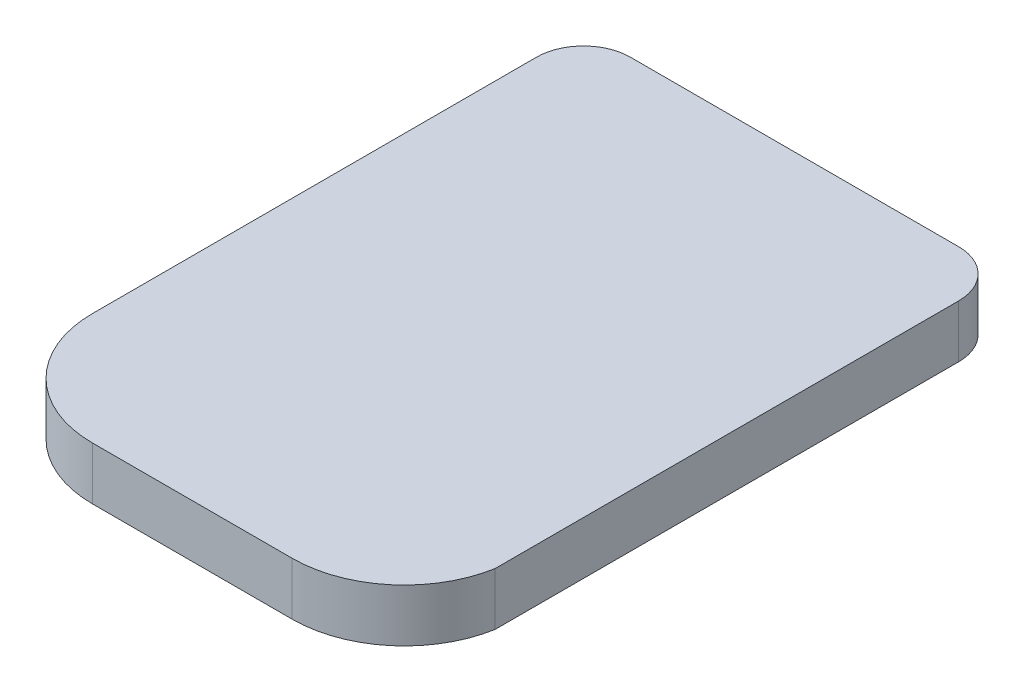
ISO-10303-21;
HEADER;
FILE_DESCRIPTION(('STEP AP214'),'2;1');
FILE_NAME('part.step','',(''),(''),'','','');
FILE_SCHEMA(('AUTOMOTIVE_DESIGN { 1 0 10303 214 1 1 1 1 }'));
ENDSEC;
DATA;
#1=APPLICATION_CONTEXT('core data for automotive mechanical design processes');
#2=APPLICATION_PROTOCOL_DEFINITION('international standard','automotive_design',2000,#1);
#3=PRODUCT_CONTEXT('',#1,'mechanical');
#4=PRODUCT('Part','Part','',(#3));
#5=PRODUCT_RELATED_PRODUCT_CATEGORY('part','',(#4));
#6=PRODUCT_DEFINITION_FORMATION('','',#4);
#7=PRODUCT_DEFINITION_CONTEXT('part definition',#1,'design');
#8=PRODUCT_DEFINITION('design','',#6,#7);
#9=PRODUCT_DEFINITION_SHAPE('','',#8);
#10=(LENGTH_UNIT() NAMED_UNIT(*) SI_UNIT(.MILLI.,.METRE.));
#11=(NAMED_UNIT(*) PLANE_ANGLE_UNIT() SI_UNIT($,.RADIAN.));
#12=(NAMED_UNIT(*) SI_UNIT($,.STERADIAN.) SOLID_ANGLE_UNIT());
#13=UNCERTAINTY_MEASURE_WITH_UNIT(LENGTH_MEASURE(1.E-05),#10,'distance_accuracy_value','');
#14=(GEOMETRIC_REPRESENTATION_CONTEXT(3) GLOBAL_UNCERTAINTY_ASSIGNED_CONTEXT((#13)) GLOBAL_UNIT_ASSIGNED_CONTEXT((#10,
#11,#12)) REPRESENTATION_CONTEXT('',''));
#15=CARTESIAN_POINT('',(0.,0.,0.));
#16=DIRECTION('',(0.,0.,1.));
#17=DIRECTION('',(1.,0.,0.));
#18=AXIS2_PLACEMENT_3D('',#15,#16,#17);
#19=CARTESIAN_POINT('',(-32.4120760525283,10.,-46.9119756715994));
#20=DIRECTION('',(0.,-1.,0.));
#21=DIRECTION('',(0.,0.,-1.));
#22=AXIS2_PLACEMENT_3D('',#19,#20,#21);
#23=CYLINDRICAL_SURFACE('',#22,8.89);
#24=CARTESIAN_POINT('',(-32.4120760525283,0.,-46.9119756715994));
#25=DIRECTION('',(0.,1.,0.));
#26=DIRECTION('',(0.,0.,1.));
#27=AXIS2_PLACEMENT_3D('',#24,#25,#26);
#28=CIRCLE('',#27,8.89);
#29=CARTESIAN_POINT('',(-32.4120760525283,0.,-55.8019756715994));
#30=VERTEX_POINT('',#29);
#31=CARTESIAN_POINT('',(-41.3020760525283,0.,-46.9119756715994));
#32=VERTEX_POINT('',#31);
#33=EDGE_CURVE('E140',#30,#32,#28,.T.);
#34=ORIENTED_EDGE('',*,*,#33,.T.);
#35=DIRECTION('',(0.,-1.,0.));
#36=VECTOR('',#35,1.);
#37=CARTESIAN_POINT('',(-41.3020760525283,10.,-46.9119756715994));
#38=LINE('',#37,#36);
#39=CARTESIAN_POINT('',(-41.3020760525283,10.,-46.9119756715994));
#40=VERTEX_POINT('',#39);
#41=EDGE_CURVE('E11',#40,#32,#38,.T.);
#42=ORIENTED_EDGE('',*,*,#41,.F.);
#43=CARTESIAN_POINT('',(-32.4120760525283,10.,-46.9119756715994));
#44=DIRECTION('',(0.,1.,0.));
#45=DIRECTION('',(0.,0.,1.));
#46=AXIS2_PLACEMENT_3D('',#43,#44,#45);
#47=CIRCLE('',#46,8.89);
#48=CARTESIAN_POINT('',(-32.4120760525283,10.,-55.8019756715994));
#49=VERTEX_POINT('',#48);
#50=EDGE_CURVE('E162',#49,#40,#47,.T.);
#51=ORIENTED_EDGE('',*,*,#50,.F.);
#52=DIRECTION('',(0.,-1.,0.));
#53=VECTOR('',#52,1.);
#54=CARTESIAN_POINT('',(-32.4120760525283,10.,-55.8019756715994));
#55=LINE('',#54,#53);
#56=EDGE_CURVE('E136',#49,#30,#55,.T.);
#57=ORIENTED_EDGE('',*,*,#56,.T.);
#58=EDGE_LOOP('',(#34,#42,#51,#57));
#59=FACE_BOUND('',#58,.T.);
#60=ADVANCED_FACE('F39',(#59),#23,.T.);
#61=CARTESIAN_POINT('',(-41.3020760525283,10.,-46.9119756715994));
#62=DIRECTION('',(1.,0.,0.));
#63=DIRECTION('',(0.,0.,-1.));
#64=AXIS2_PLACEMENT_3D('',#61,#62,#63);
#65=PLANE('',#64);
#66=DIRECTION('',(0.,0.,1.));
#67=VECTOR('',#66,1.);
#68=CARTESIAN_POINT('',(-41.3020760525283,0.,-46.9119756715994));
#69=LINE('',#68,#67);
#70=CARTESIAN_POINT('',(-41.3020760525283,0.,37.2622137303775));
#71=VERTEX_POINT('',#70);
#72=EDGE_CURVE('E144',#32,#71,#69,.T.);
#73=ORIENTED_EDGE('',*,*,#72,.T.);
#74=DIRECTION('',(0.,-1.,0.));
#75=VECTOR('',#74,1.);
#76=CARTESIAN_POINT('',(-41.3020760525283,10.,37.2622137303775));
#77=LINE('',#76,#75);
#78=CARTESIAN_POINT('',(-41.3020760525283,10.,37.2622137303775));
#79=VERTEX_POINT('',#78);
#80=EDGE_CURVE('E48',#79,#71,#77,.T.);
#81=ORIENTED_EDGE('',*,*,#80,.F.);
#82=DIRECTION('',(0.,0.,1.));
#83=VECTOR('',#82,1.);
#84=CARTESIAN_POINT('',(-41.3020760525283,10.,-46.9119756715994));
#85=LINE('',#84,#83);
#86=EDGE_CURVE('E99',#40,#79,#85,.T.);
#87=ORIENTED_EDGE('',*,*,#86,.F.);
#88=ORIENTED_EDGE('',*,*,#41,.T.);
#89=EDGE_LOOP('',(#73,#81,#87,#88));
#90=FACE_BOUND('',#89,.T.);
#91=ADVANCED_FACE('F208',(#90),#65,.F.);
#92=CARTESIAN_POINT('',(-20.0662654545052,10.,37.2622137303774));
#93=DIRECTION('',(0.,-1.,0.));
#94=DIRECTION('',(0.,0.,-1.));
#95=AXIS2_PLACEMENT_3D('',#92,#93,#94);
#96=CYLINDRICAL_SURFACE('',#95,21.2358105980231);
#97=CARTESIAN_POINT('',(-20.0662654545052,0.,37.2622137303774));
#98=DIRECTION('',(0.,1.,0.));
#99=DIRECTION('',(0.,0.,1.));
#100=AXIS2_PLACEMENT_3D('',#97,#98,#99);
#101=CIRCLE('',#100,21.2358105980231);
#102=CARTESIAN_POINT('',(-20.0662654545052,0.,58.4980243284006));
#103=VERTEX_POINT('',#102);
#104=EDGE_CURVE('E147',#71,#103,#101,.T.);
#105=ORIENTED_EDGE('',*,*,#104,.T.);
#106=DIRECTION('',(0.,-1.,0.));
#107=VECTOR('',#106,1.);
#108=CARTESIAN_POINT('',(-20.0662654545052,10.,58.4980243284006));
#109=LINE('',#108,#107);
#110=CARTESIAN_POINT('',(-20.0662654545052,10.,58.4980243284006));
#111=VERTEX_POINT('',#110);
#112=EDGE_CURVE('E173',#111,#103,#109,.T.);
#113=ORIENTED_EDGE('',*,*,#112,.F.);
#114=CARTESIAN_POINT('',(-20.0662654545052,10.,37.2622137303774));
#115=DIRECTION('',(0.,1.,0.));
#116=DIRECTION('',(0.,0.,1.));
#117=AXIS2_PLACEMENT_3D('',#114,#115,#116);
#118=CIRCLE('',#117,21.2358105980231);
#119=EDGE_CURVE('E183',#79,#111,#118,.T.);
#120=ORIENTED_EDGE('',*,*,#119,.F.);
#121=ORIENTED_EDGE('',*,*,#80,.T.);
#122=EDGE_LOOP('',(#105,#113,#120,#121));
#123=FACE_BOUND('',#122,.T.);
#124=ADVANCED_FACE('F181',(#123),#96,.T.);
#125=CARTESIAN_POINT('',(-20.0662654545052,10.,58.4980243284006));
#126=DIRECTION('',(0.,0.,-1.));
#127=DIRECTION('',(-1.,0.,0.));
#128=AXIS2_PLACEMENT_3D('',#125,#126,#127);
#129=PLANE('',#128);
#130=DIRECTION('',(1.,0.,0.));
#131=VECTOR('',#130,1.);
#132=CARTESIAN_POINT('',(-20.0662654545052,0.,58.4980243284006));
#133=LINE('',#132,#131);
#134=CARTESIAN_POINT('',(17.7969543862896,0.,58.4980243284006));
#135=VERTEX_POINT('',#134);
#136=EDGE_CURVE('E150',#103,#135,#133,.T.);
#137=ORIENTED_EDGE('',*,*,#136,.T.);
#138=DIRECTION('',(0.,-1.,0.));
#139=VECTOR('',#138,1.);
#140=CARTESIAN_POINT('',(17.7969543862896,10.,58.4980243284006));
#141=LINE('',#140,#139);
#142=CARTESIAN_POINT('',(17.7969543862896,10.,58.4980243284006));
#143=VERTEX_POINT('',#142);
#144=EDGE_CURVE('E169',#143,#135,#141,.T.);
#145=ORIENTED_EDGE('',*,*,#144,.F.);
#146=DIRECTION('',(1.,0.,0.));
#147=VECTOR('',#146,1.);
#148=CARTESIAN_POINT('',(-20.0662654545052,10.,58.4980243284006));
#149=LINE('',#148,#147);
#150=EDGE_CURVE('E196',#111,#143,#149,.T.);
#151=ORIENTED_EDGE('',*,*,#150,.F.);
#152=ORIENTED_EDGE('',*,*,#112,.T.);
#153=EDGE_LOOP('',(#137,#145,#151,#152));
#154=FACE_BOUND('',#153,.T.);
#155=ADVANCED_FACE('F191',(#154),#129,.F.);
#156=CARTESIAN_POINT('',(17.7969543862896,10.,37.2622137303775));
#157=DIRECTION('',(0.,-1.,0.));
#158=DIRECTION('',(0.,0.,-1.));
#159=AXIS2_PLACEMENT_3D('',#156,#157,#158);
#160=CYLINDRICAL_SURFACE('',#159,21.2358105980231);
#161=CARTESIAN_POINT('',(17.7969543862896,0.,37.2622137303775));
#162=DIRECTION('',(0.,1.,0.));
#163=DIRECTION('',(0.,0.,1.));
#164=AXIS2_PLACEMENT_3D('',#161,#162,#163);
#165=CIRCLE('',#164,21.2358105980231);
#166=CARTESIAN_POINT('',(38.7079239474717,0.,40.9623493720025));
#167=VERTEX_POINT('',#166);
#168=EDGE_CURVE('E153',#135,#167,#165,.T.);
#169=ORIENTED_EDGE('',*,*,#168,.T.);
#170=DIRECTION('',(0.,-1.,0.));
#171=VECTOR('',#170,1.);
#172=CARTESIAN_POINT('',(38.7079239474717,10.,40.9623493720025));
#173=LINE('',#172,#171);
#174=CARTESIAN_POINT('',(38.7079239474717,10.,40.9623493720025));
#175=VERTEX_POINT('',#174);
#176=EDGE_CURVE('E129',#175,#167,#173,.T.);
#177=ORIENTED_EDGE('',*,*,#176,.F.);
#178=CARTESIAN_POINT('',(17.7969543862896,10.,37.2622137303775));
#179=DIRECTION('',(0.,1.,0.));
#180=DIRECTION('',(0.,0.,1.));
#181=AXIS2_PLACEMENT_3D('',#178,#179,#180);
#182=CIRCLE('',#181,21.2358105980231);
#183=EDGE_CURVE('E118',#143,#175,#182,.T.);
#184=ORIENTED_EDGE('',*,*,#183,.F.);
#185=ORIENTED_EDGE('',*,*,#144,.T.);
#186=EDGE_LOOP('',(#169,#177,#184,#185));
#187=FACE_BOUND('',#186,.T.);
#188=ADVANCED_FACE('F194',(#187),#160,.T.);
#189=CARTESIAN_POINT('',(38.7079239474717,10.,-46.9119756715994));
#190=DIRECTION('',(-1.,0.,0.));
#191=DIRECTION('',(0.,0.,1.));
#192=AXIS2_PLACEMENT_3D('',#189,#190,#191);
#193=PLANE('',#192);
#194=DIRECTION('',(0.,0.,-1.));
#195=VECTOR('',#194,1.);
#196=CARTESIAN_POINT('',(38.7079239474717,0.,-46.9119756715994));
#197=LINE('',#196,#195);
#198=CARTESIAN_POINT('',(38.7079239474717,0.,-46.9119756715994));
#199=VERTEX_POINT('',#198);
#200=EDGE_CURVE('E127',#167,#199,#197,.T.);
#201=ORIENTED_EDGE('',*,*,#200,.T.);
#202=DIRECTION('',(0.,-1.,0.));
#203=VECTOR('',#202,1.);
#204=CARTESIAN_POINT('',(38.7079239474717,10.,-46.9119756715994));
#205=LINE('',#204,#203);
#206=CARTESIAN_POINT('',(38.7079239474717,10.,-46.9119756715994));
#207=VERTEX_POINT('',#206);
#208=EDGE_CURVE('E124',#207,#199,#205,.T.);
#209=ORIENTED_EDGE('',*,*,#208,.F.);
#210=DIRECTION('',(0.,0.,-1.));
#211=VECTOR('',#210,1.);
#212=CARTESIAN_POINT('',(38.7079239474717,10.,-46.9119756715994));
#213=LINE('',#212,#211);
#214=EDGE_CURVE('E112',#175,#207,#213,.T.);
#215=ORIENTED_EDGE('',*,*,#214,.F.);
#216=ORIENTED_EDGE('',*,*,#176,.T.);
#217=EDGE_LOOP('',(#201,#209,#215,#216));
#218=FACE_BOUND('',#217,.T.);
#219=ADVANCED_FACE('F125',(#218),#193,.F.);
#220=CARTESIAN_POINT('',(29.8179239474717,10.,-46.9119756715994));
#221=DIRECTION('',(0.,-1.,0.));
#222=DIRECTION('',(0.,0.,-1.));
#223=AXIS2_PLACEMENT_3D('',#220,#221,#222);
#224=CYLINDRICAL_SURFACE('',#223,8.89000000000002);
#225=CARTESIAN_POINT('',(29.8179239474717,0.,-46.9119756715994));
#226=DIRECTION('',(0.,1.,0.));
#227=DIRECTION('',(0.,0.,1.));
#228=AXIS2_PLACEMENT_3D('',#225,#226,#227);
#229=CIRCLE('',#228,8.89000000000002);
#230=CARTESIAN_POINT('',(29.8179239474717,0.,-55.8019756715994));
#231=VERTEX_POINT('',#230);
#232=EDGE_CURVE('E85',#199,#231,#229,.T.);
#233=ORIENTED_EDGE('',*,*,#232,.T.);
#234=DIRECTION('',(0.,-1.,0.));
#235=VECTOR('',#234,1.);
#236=CARTESIAN_POINT('',(29.8179239474717,10.,-55.8019756715994));
#237=LINE('',#236,#235);
#238=CARTESIAN_POINT('',(29.8179239474717,10.,-55.8019756715994));
#239=VERTEX_POINT('',#238);
#240=EDGE_CURVE('E130',#239,#231,#237,.T.);
#241=ORIENTED_EDGE('',*,*,#240,.F.);
#242=CARTESIAN_POINT('',(29.8179239474717,10.,-46.9119756715994));
#243=DIRECTION('',(0.,1.,0.));
#244=DIRECTION('',(0.,0.,1.));
#245=AXIS2_PLACEMENT_3D('',#242,#243,#244);
#246=CIRCLE('',#245,8.89000000000002);
#247=EDGE_CURVE('E116',#207,#239,#246,.T.);
#248=ORIENTED_EDGE('',*,*,#247,.F.);
#249=ORIENTED_EDGE('',*,*,#208,.T.);
#250=EDGE_LOOP('',(#233,#241,#248,#249));
#251=FACE_BOUND('',#250,.T.);
#252=ADVANCED_FACE('F132',(#251),#224,.T.);
#253=CARTESIAN_POINT('',(29.8179239474717,10.,-55.8019756715994));
#254=DIRECTION('',(0.,0.,1.));
#255=DIRECTION('',(1.,0.,0.));
#256=AXIS2_PLACEMENT_3D('',#253,#254,#255);
#257=PLANE('',#256);
#258=DIRECTION('',(-1.,0.,0.));
#259=VECTOR('',#258,1.);
#260=CARTESIAN_POINT('',(29.8179239474717,0.,-55.8019756715994));
#261=LINE('',#260,#259);
#262=EDGE_CURVE('E91',#231,#30,#261,.T.);
#263=ORIENTED_EDGE('',*,*,#262,.T.);
#264=ORIENTED_EDGE('',*,*,#56,.F.);
#265=DIRECTION('',(-1.,0.,0.));
#266=VECTOR('',#265,1.);
#267=CARTESIAN_POINT('',(29.8179239474717,10.,-55.8019756715994));
#268=LINE('',#267,#266);
#269=EDGE_CURVE('E56',#239,#49,#268,.T.);
#270=ORIENTED_EDGE('',*,*,#269,.F.);
#271=ORIENTED_EDGE('',*,*,#240,.T.);
#272=EDGE_LOOP('',(#263,#264,#270,#271));
#273=FACE_BOUND('',#272,.T.);
#274=ADVANCED_FACE('F224',(#273),#257,.F.);
#275=CARTESIAN_POINT('',(-32.4120760525283,10.,-46.9119756715994));
#276=DIRECTION('',(0.,1.,0.));
#277=DIRECTION('',(0.,0.,1.));
#278=AXIS2_PLACEMENT_3D('',#275,#276,#277);
#279=PLANE('',#278);
#280=ORIENTED_EDGE('',*,*,#50,.T.);
#281=ORIENTED_EDGE('',*,*,#86,.T.);
#282=ORIENTED_EDGE('',*,*,#119,.T.);
#283=ORIENTED_EDGE('',*,*,#150,.T.);
#284=ORIENTED_EDGE('',*,*,#183,.T.);
#285=ORIENTED_EDGE('',*,*,#214,.T.);
#286=ORIENTED_EDGE('',*,*,#247,.T.);
#287=ORIENTED_EDGE('',*,*,#269,.T.);
#288=EDGE_LOOP('',(#280,#281,#282,#283,#284,#285,#286,#287));
#289=FACE_BOUND('',#288,.T.);
#290=ADVANCED_FACE('F114',(#289),#279,.T.);
#291=CARTESIAN_POINT('',(-32.4120760525283,0.,-46.9119756715994));
#292=DIRECTION('',(0.,1.,0.));
#293=DIRECTION('',(0.,0.,1.));
#294=AXIS2_PLACEMENT_3D('',#291,#292,#293);
#295=PLANE('',#294);
#296=ORIENTED_EDGE('',*,*,#33,.F.);
#297=ORIENTED_EDGE('',*,*,#262,.F.);
#298=ORIENTED_EDGE('',*,*,#232,.F.);
#299=ORIENTED_EDGE('',*,*,#200,.F.);
#300=ORIENTED_EDGE('',*,*,#168,.F.);
#301=ORIENTED_EDGE('',*,*,#136,.F.);
#302=ORIENTED_EDGE('',*,*,#104,.F.);
#303=ORIENTED_EDGE('',*,*,#72,.F.);
#304=EDGE_LOOP('',(#296,#297,#298,#299,#300,#301,#302,#303));
#305=FACE_BOUND('',#304,.T.);
#306=ADVANCED_FACE('F187',(#305),#295,.F.);
#307=CLOSED_SHELL('',(#60,#91,#124,#155,#188,#219,#252,#274,#290,#306));
#308=MANIFOLD_SOLID_BREP('B2',#307);
#309=ADVANCED_BREP_SHAPE_REPRESENTATION('',(#18,#308),#14);
#310=SHAPE_DEFINITION_REPRESENTATION(#9,#309);
ENDSEC;
END-ISO-10303-21;
